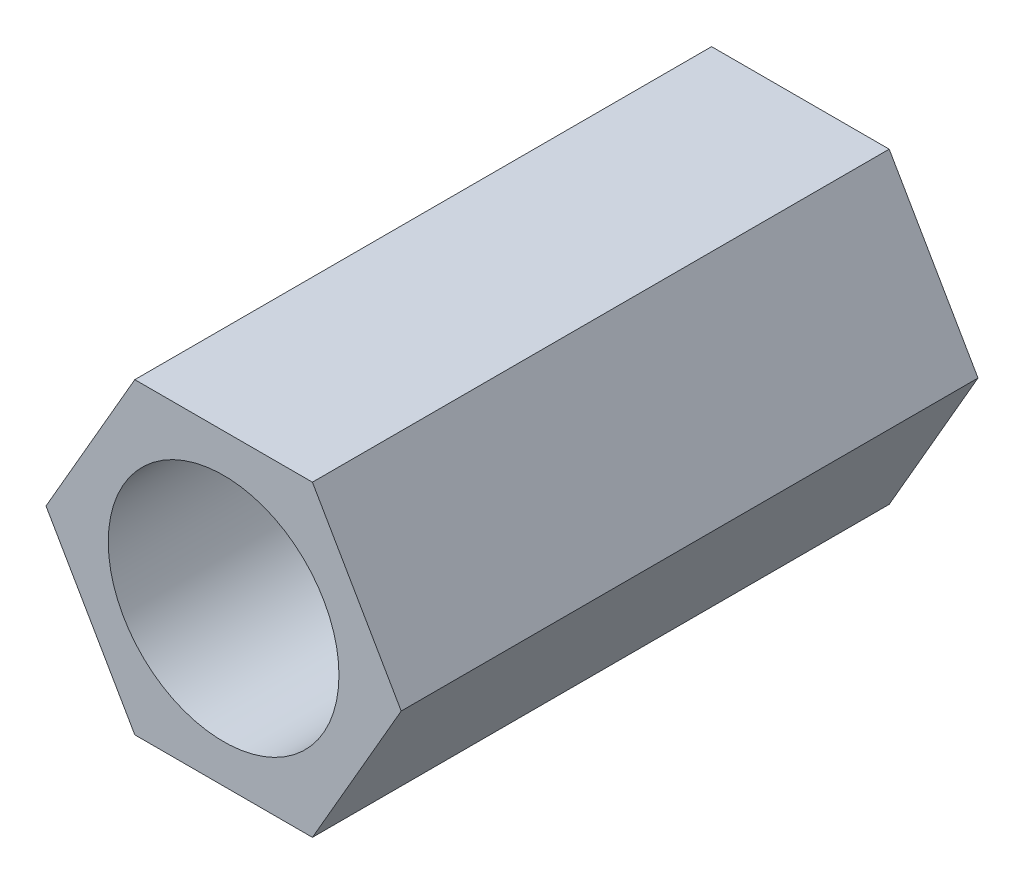
ISO-10303-21;
HEADER;
FILE_DESCRIPTION(('STEP AP214'),'2;1');
FILE_NAME('part.step','',(''),(''),'','','');
FILE_SCHEMA(('AUTOMOTIVE_DESIGN { 1 0 10303 214 1 1 1 1 }'));
ENDSEC;
DATA;
#1=APPLICATION_CONTEXT('core data for automotive mechanical design processes');
#2=APPLICATION_PROTOCOL_DEFINITION('international standard','automotive_design',2000,#1);
#3=PRODUCT_CONTEXT('',#1,'mechanical');
#4=PRODUCT('Part','Part','',(#3));
#5=PRODUCT_RELATED_PRODUCT_CATEGORY('part','',(#4));
#6=PRODUCT_DEFINITION_FORMATION('','',#4);
#7=PRODUCT_DEFINITION_CONTEXT('part definition',#1,'design');
#8=PRODUCT_DEFINITION('design','',#6,#7);
#9=PRODUCT_DEFINITION_SHAPE('','',#8);
#10=(LENGTH_UNIT() NAMED_UNIT(*) SI_UNIT(.MILLI.,.METRE.));
#11=(NAMED_UNIT(*) PLANE_ANGLE_UNIT() SI_UNIT($,.RADIAN.));
#12=(NAMED_UNIT(*) SI_UNIT($,.STERADIAN.) SOLID_ANGLE_UNIT());
#13=UNCERTAINTY_MEASURE_WITH_UNIT(LENGTH_MEASURE(1.E-05),#10,'distance_accuracy_value','');
#14=(GEOMETRIC_REPRESENTATION_CONTEXT(3) GLOBAL_UNCERTAINTY_ASSIGNED_CONTEXT((#13)) GLOBAL_UNIT_ASSIGNED_CONTEXT((#10,
#11,#12)) REPRESENTATION_CONTEXT('',''));
#15=CARTESIAN_POINT('',(0.,0.,0.));
#16=DIRECTION('',(0.,0.,1.));
#17=DIRECTION('',(1.,0.,0.));
#18=AXIS2_PLACEMENT_3D('',#15,#16,#17);
#19=CARTESIAN_POINT('',(0.,0.,7.5));
#20=DIRECTION('',(0.,0.,1.));
#21=DIRECTION('',(1.,0.,0.));
#22=AXIS2_PLACEMENT_3D('',#19,#20,#21);
#23=PLANE('',#22);
#24=DIRECTION('',(0.5,0.866025403784439,0.));
#25=VECTOR('',#24,1.);
#26=CARTESIAN_POINT('',(1.15470053837925,-2.,7.5));
#27=LINE('',#26,#25);
#28=CARTESIAN_POINT('',(1.15470053837925,-2.,7.5));
#29=VERTEX_POINT('',#28);
#30=CARTESIAN_POINT('',(2.3094010767585,0.,7.5));
#31=VERTEX_POINT('',#30);
#32=EDGE_CURVE('E156',#29,#31,#27,.T.);
#33=ORIENTED_EDGE('',*,*,#32,.T.);
#34=DIRECTION('',(-0.5,0.866025403784439,0.));
#35=VECTOR('',#34,1.);
#36=CARTESIAN_POINT('',(2.3094010767585,0.,7.5));
#37=LINE('',#36,#35);
#38=CARTESIAN_POINT('',(1.15470053837925,2.,7.5));
#39=VERTEX_POINT('',#38);
#40=EDGE_CURVE('E104',#31,#39,#37,.T.);
#41=ORIENTED_EDGE('',*,*,#40,.T.);
#42=DIRECTION('',(-1.,0.,0.));
#43=VECTOR('',#42,1.);
#44=CARTESIAN_POINT('',(1.15470053837925,2.,7.5));
#45=LINE('',#44,#43);
#46=CARTESIAN_POINT('',(-1.15470053837925,2.,7.5));
#47=VERTEX_POINT('',#46);
#48=EDGE_CURVE('E117',#39,#47,#45,.T.);
#49=ORIENTED_EDGE('',*,*,#48,.T.);
#50=DIRECTION('',(-0.5,-0.866025403784439,0.));
#51=VECTOR('',#50,1.);
#52=CARTESIAN_POINT('',(-1.15470053837925,2.,7.5));
#53=LINE('',#52,#51);
#54=CARTESIAN_POINT('',(-2.3094010767585,0.,7.5));
#55=VERTEX_POINT('',#54);
#56=EDGE_CURVE('E111',#47,#55,#53,.T.);
#57=ORIENTED_EDGE('',*,*,#56,.T.);
#58=DIRECTION('',(0.5,-0.866025403784438,0.));
#59=VECTOR('',#58,1.);
#60=CARTESIAN_POINT('',(-2.3094010767585,0.,7.5));
#61=LINE('',#60,#59);
#62=CARTESIAN_POINT('',(-1.15470053837925,-2.,7.5));
#63=VERTEX_POINT('',#62);
#64=EDGE_CURVE('E115',#55,#63,#61,.T.);
#65=ORIENTED_EDGE('',*,*,#64,.T.);
#66=DIRECTION('',(1.,0.,0.));
#67=VECTOR('',#66,1.);
#68=CARTESIAN_POINT('',(-1.15470053837925,-2.,7.5));
#69=LINE('',#68,#67);
#70=EDGE_CURVE('E67',#63,#29,#69,.T.);
#71=ORIENTED_EDGE('',*,*,#70,.T.);
#72=EDGE_LOOP('',(#33,#41,#49,#57,#65,#71));
#73=FACE_BOUND('',#72,.T.);
#74=CARTESIAN_POINT('',(0.,0.,7.5));
#75=DIRECTION('',(0.,0.,1.));
#76=DIRECTION('',(1.,0.,0.));
#77=AXIS2_PLACEMENT_3D('',#74,#75,#76);
#78=CIRCLE('',#77,1.5);
#79=CARTESIAN_POINT('',(1.5,0.,7.5));
#80=VERTEX_POINT('',#79);
#81=EDGE_CURVE('E144',#80,#80,#78,.T.);
#82=ORIENTED_EDGE('',*,*,#81,.F.);
#83=EDGE_LOOP('',(#82));
#84=FACE_BOUND('',#83,.T.);
#85=ADVANCED_FACE('F49',(#73,#84),#23,.T.);
#86=CARTESIAN_POINT('',(0.,0.,0.));
#87=DIRECTION('',(0.,0.,1.));
#88=DIRECTION('',(1.,0.,0.));
#89=AXIS2_PLACEMENT_3D('',#86,#87,#88);
#90=PLANE('',#89);
#91=DIRECTION('',(0.5,0.866025403784439,0.));
#92=VECTOR('',#91,1.);
#93=CARTESIAN_POINT('',(1.15470053837925,-2.,0.));
#94=LINE('',#93,#92);
#95=CARTESIAN_POINT('',(1.15470053837925,-2.,0.));
#96=VERTEX_POINT('',#95);
#97=CARTESIAN_POINT('',(2.3094010767585,0.,0.));
#98=VERTEX_POINT('',#97);
#99=EDGE_CURVE('E139',#96,#98,#94,.T.);
#100=ORIENTED_EDGE('',*,*,#99,.F.);
#101=DIRECTION('',(1.,0.,0.));
#102=VECTOR('',#101,1.);
#103=CARTESIAN_POINT('',(-1.15470053837925,-2.,0.));
#104=LINE('',#103,#102);
#105=CARTESIAN_POINT('',(-1.15470053837925,-2.,0.));
#106=VERTEX_POINT('',#105);
#107=EDGE_CURVE('E96',#106,#96,#104,.T.);
#108=ORIENTED_EDGE('',*,*,#107,.F.);
#109=DIRECTION('',(0.5,-0.866025403784438,0.));
#110=VECTOR('',#109,1.);
#111=CARTESIAN_POINT('',(-2.3094010767585,0.,0.));
#112=LINE('',#111,#110);
#113=CARTESIAN_POINT('',(-2.3094010767585,0.,0.));
#114=VERTEX_POINT('',#113);
#115=EDGE_CURVE('E90',#114,#106,#112,.T.);
#116=ORIENTED_EDGE('',*,*,#115,.F.);
#117=DIRECTION('',(-0.5,-0.866025403784439,0.));
#118=VECTOR('',#117,1.);
#119=CARTESIAN_POINT('',(-1.15470053837925,2.,0.));
#120=LINE('',#119,#118);
#121=CARTESIAN_POINT('',(-1.15470053837925,2.,0.));
#122=VERTEX_POINT('',#121);
#123=EDGE_CURVE('E126',#122,#114,#120,.T.);
#124=ORIENTED_EDGE('',*,*,#123,.F.);
#125=DIRECTION('',(-1.,0.,0.));
#126=VECTOR('',#125,1.);
#127=CARTESIAN_POINT('',(1.15470053837925,2.,0.));
#128=LINE('',#127,#126);
#129=CARTESIAN_POINT('',(1.15470053837925,2.,0.));
#130=VERTEX_POINT('',#129);
#131=EDGE_CURVE('E147',#130,#122,#128,.T.);
#132=ORIENTED_EDGE('',*,*,#131,.F.);
#133=DIRECTION('',(-0.5,0.866025403784439,0.));
#134=VECTOR('',#133,1.);
#135=CARTESIAN_POINT('',(2.3094010767585,0.,0.));
#136=LINE('',#135,#134);
#137=EDGE_CURVE('E143',#98,#130,#136,.T.);
#138=ORIENTED_EDGE('',*,*,#137,.F.);
#139=EDGE_LOOP('',(#100,#108,#116,#124,#132,#138));
#140=FACE_BOUND('',#139,.T.);
#141=CARTESIAN_POINT('',(0.,0.,0.));
#142=DIRECTION('',(0.,0.,1.));
#143=DIRECTION('',(1.,0.,0.));
#144=AXIS2_PLACEMENT_3D('',#141,#142,#143);
#145=CIRCLE('',#144,1.5);
#146=CARTESIAN_POINT('',(1.5,0.,0.));
#147=VERTEX_POINT('',#146);
#148=EDGE_CURVE('E289',#147,#147,#145,.T.);
#149=ORIENTED_EDGE('',*,*,#148,.T.);
#150=EDGE_LOOP('',(#149));
#151=FACE_BOUND('',#150,.T.);
#152=ADVANCED_FACE('F169',(#140,#151),#90,.F.);
#153=CARTESIAN_POINT('',(1.15470053837925,-2.,7.5));
#154=DIRECTION('',(-0.866025403784439,0.5,0.));
#155=DIRECTION('',(-0.5,-0.866025403784439,0.));
#156=AXIS2_PLACEMENT_3D('',#153,#154,#155);
#157=PLANE('',#156);
#158=ORIENTED_EDGE('',*,*,#99,.T.);
#159=DIRECTION('',(0.,0.,-1.));
#160=VECTOR('',#159,1.);
#161=CARTESIAN_POINT('',(2.3094010767585,0.,7.5));
#162=LINE('',#161,#160);
#163=EDGE_CURVE('E11',#31,#98,#162,.T.);
#164=ORIENTED_EDGE('',*,*,#163,.F.);
#165=ORIENTED_EDGE('',*,*,#32,.F.);
#166=DIRECTION('',(0.,0.,-1.));
#167=VECTOR('',#166,1.);
#168=CARTESIAN_POINT('',(1.15470053837925,-2.,7.5));
#169=LINE('',#168,#167);
#170=EDGE_CURVE('E135',#29,#96,#169,.T.);
#171=ORIENTED_EDGE('',*,*,#170,.T.);
#172=EDGE_LOOP('',(#158,#164,#165,#171));
#173=FACE_BOUND('',#172,.T.);
#174=ADVANCED_FACE('F51',(#173),#157,.F.);
#175=CARTESIAN_POINT('',(2.3094010767585,0.,7.5));
#176=DIRECTION('',(-0.866025403784439,-0.5,0.));
#177=DIRECTION('',(0.5,-0.866025403784439,0.));
#178=AXIS2_PLACEMENT_3D('',#175,#176,#177);
#179=PLANE('',#178);
#180=ORIENTED_EDGE('',*,*,#137,.T.);
#181=DIRECTION('',(0.,0.,-1.));
#182=VECTOR('',#181,1.);
#183=CARTESIAN_POINT('',(1.15470053837925,2.,7.5));
#184=LINE('',#183,#182);
#185=EDGE_CURVE('E59',#39,#130,#184,.T.);
#186=ORIENTED_EDGE('',*,*,#185,.F.);
#187=ORIENTED_EDGE('',*,*,#40,.F.);
#188=ORIENTED_EDGE('',*,*,#163,.T.);
#189=EDGE_LOOP('',(#180,#186,#187,#188));
#190=FACE_BOUND('',#189,.T.);
#191=ADVANCED_FACE('F194',(#190),#179,.F.);
#192=CARTESIAN_POINT('',(1.15470053837925,2.,7.5));
#193=DIRECTION('',(0.,-1.,0.));
#194=DIRECTION('',(0.,0.,-1.));
#195=AXIS2_PLACEMENT_3D('',#192,#193,#194);
#196=PLANE('',#195);
#197=ORIENTED_EDGE('',*,*,#131,.T.);
#198=DIRECTION('',(0.,0.,-1.));
#199=VECTOR('',#198,1.);
#200=CARTESIAN_POINT('',(-1.15470053837925,2.,7.5));
#201=LINE('',#200,#199);
#202=EDGE_CURVE('E128',#47,#122,#201,.T.);
#203=ORIENTED_EDGE('',*,*,#202,.F.);
#204=ORIENTED_EDGE('',*,*,#48,.F.);
#205=ORIENTED_EDGE('',*,*,#185,.T.);
#206=EDGE_LOOP('',(#197,#203,#204,#205));
#207=FACE_BOUND('',#206,.T.);
#208=ADVANCED_FACE('F166',(#207),#196,.F.);
#209=CARTESIAN_POINT('',(-1.15470053837925,2.,7.5));
#210=DIRECTION('',(0.866025403784439,-0.5,0.));
#211=DIRECTION('',(0.5,0.866025403784439,0.));
#212=AXIS2_PLACEMENT_3D('',#209,#210,#211);
#213=PLANE('',#212);
#214=ORIENTED_EDGE('',*,*,#123,.T.);
#215=DIRECTION('',(0.,0.,-1.));
#216=VECTOR('',#215,1.);
#217=CARTESIAN_POINT('',(-2.3094010767585,0.,7.5));
#218=LINE('',#217,#216);
#219=EDGE_CURVE('E123',#55,#114,#218,.T.);
#220=ORIENTED_EDGE('',*,*,#219,.F.);
#221=ORIENTED_EDGE('',*,*,#56,.F.);
#222=ORIENTED_EDGE('',*,*,#202,.T.);
#223=EDGE_LOOP('',(#214,#220,#221,#222));
#224=FACE_BOUND('',#223,.T.);
#225=ADVANCED_FACE('F124',(#224),#213,.F.);
#226=CARTESIAN_POINT('',(-2.3094010767585,0.,7.5));
#227=DIRECTION('',(0.866025403784438,0.5,0.));
#228=DIRECTION('',(-0.5,0.866025403784438,0.));
#229=AXIS2_PLACEMENT_3D('',#226,#227,#228);
#230=PLANE('',#229);
#231=ORIENTED_EDGE('',*,*,#115,.T.);
#232=DIRECTION('',(0.,0.,-1.));
#233=VECTOR('',#232,1.);
#234=CARTESIAN_POINT('',(-1.15470053837925,-2.,7.5));
#235=LINE('',#234,#233);
#236=EDGE_CURVE('E129',#63,#106,#235,.T.);
#237=ORIENTED_EDGE('',*,*,#236,.F.);
#238=ORIENTED_EDGE('',*,*,#64,.F.);
#239=ORIENTED_EDGE('',*,*,#219,.T.);
#240=EDGE_LOOP('',(#231,#237,#238,#239));
#241=FACE_BOUND('',#240,.T.);
#242=ADVANCED_FACE('F131',(#241),#230,.F.);
#243=CARTESIAN_POINT('',(-1.15470053837925,-2.,7.5));
#244=DIRECTION('',(0.,1.,0.));
#245=DIRECTION('',(0.,0.,1.));
#246=AXIS2_PLACEMENT_3D('',#243,#244,#245);
#247=PLANE('',#246);
#248=ORIENTED_EDGE('',*,*,#107,.T.);
#249=ORIENTED_EDGE('',*,*,#170,.F.);
#250=ORIENTED_EDGE('',*,*,#70,.F.);
#251=ORIENTED_EDGE('',*,*,#236,.T.);
#252=EDGE_LOOP('',(#248,#249,#250,#251));
#253=FACE_BOUND('',#252,.T.);
#254=ADVANCED_FACE('F174',(#253),#247,.F.);
#255=CARTESIAN_POINT('',(0.,0.,7.5));
#256=DIRECTION('',(0.,0.,-1.));
#257=DIRECTION('',(-1.,0.,0.));
#258=AXIS2_PLACEMENT_3D('',#255,#256,#257);
#259=CYLINDRICAL_SURFACE('',#258,1.5);
#260=ORIENTED_EDGE('',*,*,#81,.T.);
#261=EDGE_LOOP('',(#260));
#262=FACE_BOUND('',#261,.T.);
#263=ORIENTED_EDGE('',*,*,#148,.F.);
#264=EDGE_LOOP('',(#263));
#265=FACE_BOUND('',#264,.T.);
#266=ADVANCED_FACE('F176',(#262,#265),#259,.F.);
#267=CLOSED_SHELL('',(#85,#152,#174,#191,#208,#225,#242,#254,#266));
#268=MANIFOLD_SOLID_BREP('B2',#267);
#269=ADVANCED_BREP_SHAPE_REPRESENTATION('',(#18,#268),#14);
#270=SHAPE_DEFINITION_REPRESENTATION(#9,#269);
ENDSEC;
END-ISO-10303-21;
